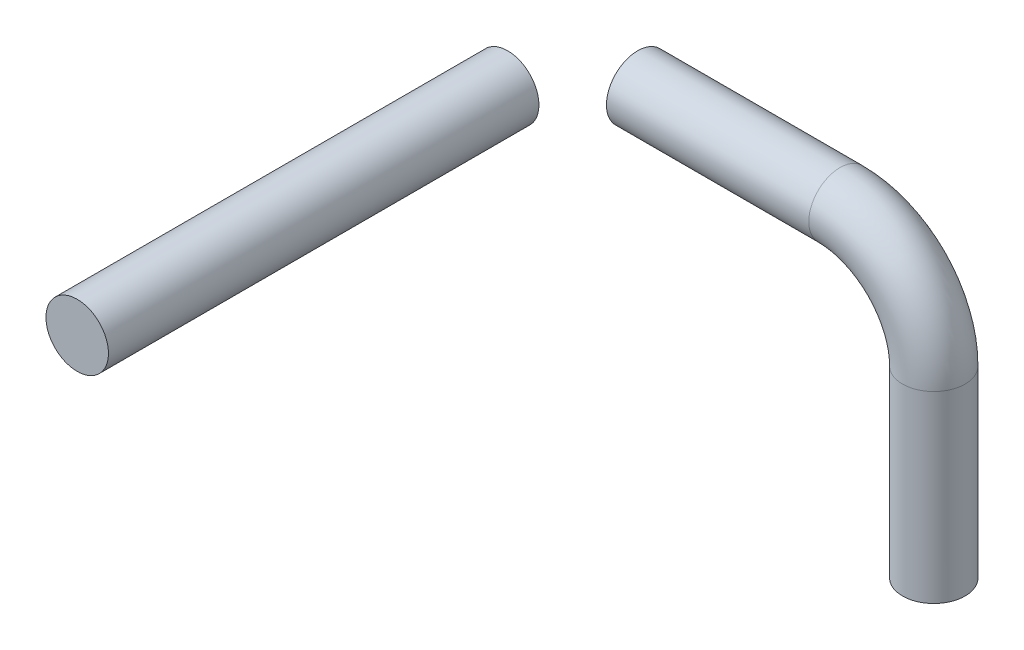
ISO-10303-21;
HEADER;
FILE_DESCRIPTION(('STEP AP214'),'2;1');
FILE_NAME('part.step','',(''),(''),'','','');
FILE_SCHEMA(('AUTOMOTIVE_DESIGN { 1 0 10303 214 1 1 1 1 }'));
ENDSEC;
DATA;
#1=APPLICATION_CONTEXT('core data for automotive mechanical design processes');
#2=APPLICATION_PROTOCOL_DEFINITION('international standard','automotive_design',2000,#1);
#3=PRODUCT_CONTEXT('',#1,'mechanical');
#4=PRODUCT('Part','Part','',(#3));
#5=PRODUCT_RELATED_PRODUCT_CATEGORY('part','',(#4));
#6=PRODUCT_DEFINITION_FORMATION('','',#4);
#7=PRODUCT_DEFINITION_CONTEXT('part definition',#1,'design');
#8=PRODUCT_DEFINITION('design','',#6,#7);
#9=PRODUCT_DEFINITION_SHAPE('','',#8);
#10=(LENGTH_UNIT() NAMED_UNIT(*) SI_UNIT(.MILLI.,.METRE.));
#11=(NAMED_UNIT(*) PLANE_ANGLE_UNIT() SI_UNIT($,.RADIAN.));
#12=(NAMED_UNIT(*) SI_UNIT($,.STERADIAN.) SOLID_ANGLE_UNIT());
#13=UNCERTAINTY_MEASURE_WITH_UNIT(LENGTH_MEASURE(1.E-05),#10,'distance_accuracy_value','');
#14=(GEOMETRIC_REPRESENTATION_CONTEXT(3) GLOBAL_UNCERTAINTY_ASSIGNED_CONTEXT((#13)) GLOBAL_UNIT_ASSIGNED_CONTEXT((#10,
#11,#12)) REPRESENTATION_CONTEXT('',''));
#15=CARTESIAN_POINT('',(0.,0.,0.));
#16=DIRECTION('',(0.,0.,1.));
#17=DIRECTION('',(1.,0.,0.));
#18=AXIS2_PLACEMENT_3D('',#15,#16,#17);
#19=CARTESIAN_POINT('',(0.,0.,-84.0740000000007));
#20=DIRECTION('',(0.,0.,1.));
#21=DIRECTION('',(-1.,0.,0.));
#22=AXIS2_PLACEMENT_3D('',#19,#20,#21);
#23=PLANE('',#22);
#24=CARTESIAN_POINT('',(0.,0.,-84.0740000000007));
#25=DIRECTION('',(0.,0.,-1.));
#26=DIRECTION('',(-1.,0.,0.));
#27=AXIS2_PLACEMENT_3D('',#24,#25,#26);
#28=CIRCLE('',#27,6.35);
#29=CARTESIAN_POINT('',(-6.35,0.,-84.0740000000007));
#30=VERTEX_POINT('',#29);
#31=EDGE_CURVE('E50',#30,#30,#28,.T.);
#32=ORIENTED_EDGE('',*,*,#31,.T.);
#33=EDGE_LOOP('',(#32));
#34=FACE_BOUND('',#33,.T.);
#35=ADVANCED_FACE('F43',(#34),#23,.F.);
#36=CARTESIAN_POINT('',(0.,0.,21.3387122421383));
#37=DIRECTION('',(0.,0.,-1.));
#38=DIRECTION('',(1.,0.,0.));
#39=AXIS2_PLACEMENT_3D('',#36,#37,#38);
#40=CYLINDRICAL_SURFACE('',#39,6.35);
#41=CARTESIAN_POINT('',(0.,0.,3.37819999999999));
#42=DIRECTION('',(0.,0.,1.));
#43=DIRECTION('',(1.,0.,0.));
#44=AXIS2_PLACEMENT_3D('',#41,#42,#43);
#45=CIRCLE('',#44,6.35);
#46=CARTESIAN_POINT('',(6.35,0.,3.37819999999999));
#47=VERTEX_POINT('',#46);
#48=EDGE_CURVE('E11',#47,#47,#45,.T.);
#49=ORIENTED_EDGE('',*,*,#48,.F.);
#50=EDGE_LOOP('',(#49));
#51=FACE_BOUND('',#50,.T.);
#52=ORIENTED_EDGE('',*,*,#31,.F.);
#53=EDGE_LOOP('',(#52));
#54=FACE_BOUND('',#53,.T.);
#55=ADVANCED_FACE('F45',(#51,#54),#40,.T.);
#56=CARTESIAN_POINT('',(0.,0.,3.37819999999999));
#57=DIRECTION('',(0.,0.,-1.));
#58=DIRECTION('',(1.,0.,0.));
#59=AXIS2_PLACEMENT_3D('',#56,#57,#58);
#60=PLANE('',#59);
#61=ORIENTED_EDGE('',*,*,#48,.T.);
#62=EDGE_LOOP('',(#61));
#63=FACE_BOUND('',#62,.T.);
#64=ADVANCED_FACE('F58',(#63),#60,.F.);
#65=CLOSED_SHELL('',(#35,#55,#64));
#66=MANIFOLD_SOLID_BREP('B2',#65);
#67=CARTESIAN_POINT('',(54.3147558894697,0.,-97.2820000000001));
#68=DIRECTION('',(-1.,0.,0.));
#69=DIRECTION('',(0.,-1.,0.));
#70=AXIS2_PLACEMENT_3D('',#67,#68,#69);
#71=CYLINDRICAL_SURFACE('',#70,6.34999999999999);
#72=CARTESIAN_POINT('',(54.3147558894697,0.,-97.2820000000001));
#73=DIRECTION('',(-1.,0.,0.));
#74=DIRECTION('',(0.,0.,1.));
#75=AXIS2_PLACEMENT_3D('',#72,#73,#74);
#76=CIRCLE('',#75,6.34999999999999);
#77=CARTESIAN_POINT('',(54.3147558894696,6.34999999999996,-97.2820000000001));
#78=VERTEX_POINT('',#77);
#79=EDGE_CURVE('E90',#78,#78,#76,.T.);
#80=ORIENTED_EDGE('',*,*,#79,.T.);
#81=EDGE_LOOP('',(#80));
#82=FACE_BOUND('',#81,.T.);
#83=CARTESIAN_POINT('',(13.2080000000033,1.24410366923564E-12,-97.2820000000001));
#84=DIRECTION('',(-1.,0.,0.));
#85=DIRECTION('',(0.,0.,1.));
#86=AXIS2_PLACEMENT_3D('',#83,#84,#85);
#87=CIRCLE('',#86,6.34999999999999);
#88=CARTESIAN_POINT('',(13.2080000000033,1.24410366923564E-12,-90.9320000000001));
#89=VERTEX_POINT('',#88);
#90=EDGE_CURVE('E42',#89,#89,#87,.T.);
#91=ORIENTED_EDGE('',*,*,#90,.F.);
#92=EDGE_LOOP('',(#91));
#93=FACE_BOUND('',#92,.T.);
#94=ADVANCED_FACE('F84',(#82,#93),#71,.T.);
#95=CARTESIAN_POINT('',(54.3147558894698,-19.05,-97.2820000000001));
#96=DIRECTION('',(0.,0.,-1.));
#97=DIRECTION('',(1.,0.,0.));
#98=AXIS2_PLACEMENT_3D('',#95,#96,#97);
#99=TOROIDAL_SURFACE('',#98,19.05,6.34999999999999);
#100=CARTESIAN_POINT('',(73.3647558894698,-19.0500000000001,-97.2820000000001));
#101=DIRECTION('',(0.,1.,0.));
#102=DIRECTION('',(0.,0.,1.));
#103=AXIS2_PLACEMENT_3D('',#100,#101,#102);
#104=CIRCLE('',#103,6.34999999999999);
#105=CARTESIAN_POINT('',(79.7147558894698,-19.0500000000002,-97.2820000000001));
#106=VERTEX_POINT('',#105);
#107=EDGE_CURVE('E94',#106,#106,#104,.T.);
#108=CARTESIAN_POINT('',(54.3147558894698,-19.05,-97.2820000000001));
#109=DIRECTION('',(0.,0.,-1.));
#110=DIRECTION('',(1.,0.,0.));
#111=AXIS2_PLACEMENT_3D('',#108,#109,#110);
#112=CIRCLE('',#111,25.3999999999999);
#113=EDGE_CURVE('',#78,#106,#112,.T.);
#114=ORIENTED_EDGE('',*,*,#79,.F.);
#115=ORIENTED_EDGE('',*,*,#107,.T.);
#116=ORIENTED_EDGE('',*,*,#113,.T.);
#117=ORIENTED_EDGE('',*,*,#113,.F.);
#118=EDGE_LOOP('',(#114,#116,#115,#117));
#119=FACE_BOUND('',#118,.T.);
#120=ADVANCED_FACE('F116',(#119),#99,.T.);
#121=CARTESIAN_POINT('',(73.3647558894698,-19.0500000000001,-97.2820000000001));
#122=DIRECTION('',(0.,-1.,0.));
#123=DIRECTION('',(0.,0.,1.));
#124=AXIS2_PLACEMENT_3D('',#121,#122,#123);
#125=CYLINDRICAL_SURFACE('',#124,6.34999999999999);
#126=ORIENTED_EDGE('',*,*,#107,.F.);
#127=EDGE_LOOP('',(#126));
#128=FACE_BOUND('',#127,.T.);
#129=CARTESIAN_POINT('',(73.3647558894698,-56.3428997600009,-97.2820000000001));
#130=DIRECTION('',(0.,1.,0.));
#131=DIRECTION('',(0.,0.,1.));
#132=AXIS2_PLACEMENT_3D('',#129,#130,#131);
#133=CIRCLE('',#132,6.34999999999999);
#134=CARTESIAN_POINT('',(73.3647558894698,-56.3428997600009,-90.9320000000001));
#135=VERTEX_POINT('',#134);
#136=EDGE_CURVE('E98',#135,#135,#133,.T.);
#137=ORIENTED_EDGE('',*,*,#136,.T.);
#138=EDGE_LOOP('',(#137));
#139=FACE_BOUND('',#138,.T.);
#140=ADVANCED_FACE('F104',(#128,#139),#125,.T.);
#141=CARTESIAN_POINT('',(13.2080000000033,1.24410366923564E-12,-97.2820000000001));
#142=DIRECTION('',(1.,0.,0.));
#143=DIRECTION('',(0.,0.,1.));
#144=AXIS2_PLACEMENT_3D('',#141,#142,#143);
#145=PLANE('',#144);
#146=ORIENTED_EDGE('',*,*,#90,.T.);
#147=EDGE_LOOP('',(#146));
#148=FACE_BOUND('',#147,.T.);
#149=ADVANCED_FACE('F108',(#148),#145,.F.);
#150=CARTESIAN_POINT('',(73.3647558894698,-56.3428997600009,-97.2820000000001));
#151=DIRECTION('',(0.,-1.,0.));
#152=DIRECTION('',(0.,0.,1.));
#153=AXIS2_PLACEMENT_3D('',#150,#151,#152);
#154=PLANE('',#153);
#155=ORIENTED_EDGE('',*,*,#136,.F.);
#156=EDGE_LOOP('',(#155));
#157=FACE_BOUND('',#156,.T.);
#158=ADVANCED_FACE('F106',(#157),#154,.T.);
#159=CLOSED_SHELL('',(#94,#120,#140,#149,#158));
#160=MANIFOLD_SOLID_BREP('B6',#159);
#161=ADVANCED_BREP_SHAPE_REPRESENTATION('',(#18,#66,#160),#14);
#162=SHAPE_DEFINITION_REPRESENTATION(#9,#161);
ENDSEC;
END-ISO-10303-21;
